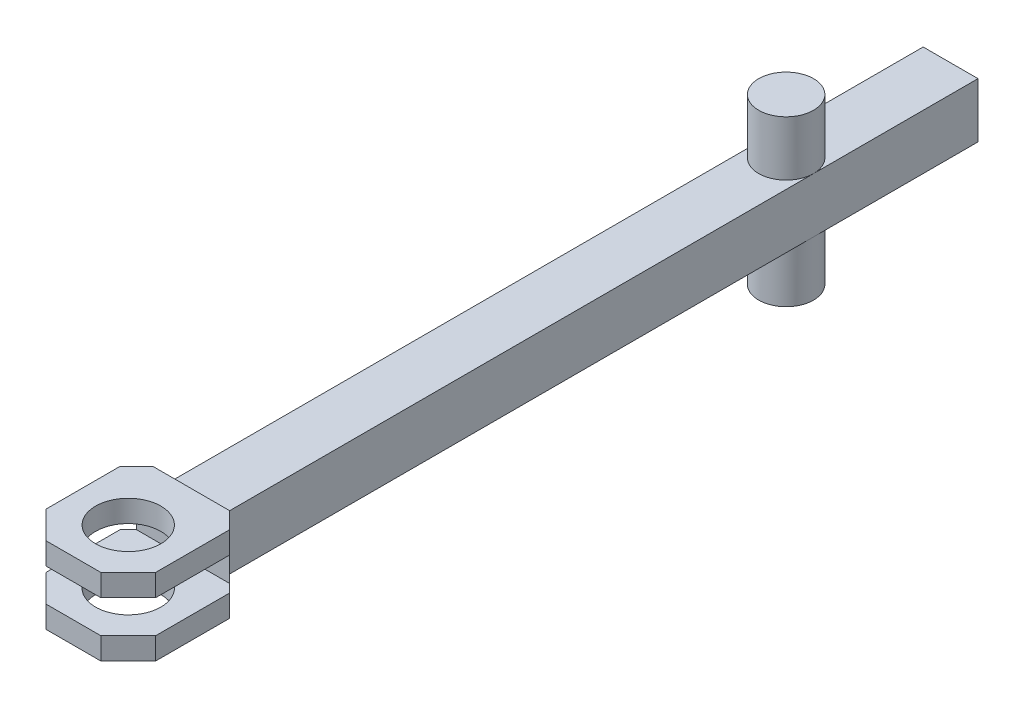
ISO-10303-21;
HEADER;
FILE_DESCRIPTION(('STEP AP214'),'2;1');
FILE_NAME('part.step','',(''),(''),'','','');
FILE_SCHEMA(('AUTOMOTIVE_DESIGN { 1 0 10303 214 1 1 1 1 }'));
ENDSEC;
DATA;
#1=APPLICATION_CONTEXT('core data for automotive mechanical design processes');
#2=APPLICATION_PROTOCOL_DEFINITION('international standard','automotive_design',2000,#1);
#3=PRODUCT_CONTEXT('',#1,'mechanical');
#4=PRODUCT('Part','Part','',(#3));
#5=PRODUCT_RELATED_PRODUCT_CATEGORY('part','',(#4));
#6=PRODUCT_DEFINITION_FORMATION('','',#4);
#7=PRODUCT_DEFINITION_CONTEXT('part definition',#1,'design');
#8=PRODUCT_DEFINITION('design','',#6,#7);
#9=PRODUCT_DEFINITION_SHAPE('','',#8);
#10=(LENGTH_UNIT() NAMED_UNIT(*) SI_UNIT(.MILLI.,.METRE.));
#11=(NAMED_UNIT(*) PLANE_ANGLE_UNIT() SI_UNIT($,.RADIAN.));
#12=(NAMED_UNIT(*) SI_UNIT($,.STERADIAN.) SOLID_ANGLE_UNIT());
#13=UNCERTAINTY_MEASURE_WITH_UNIT(LENGTH_MEASURE(1.E-05),#10,'distance_accuracy_value','');
#14=(GEOMETRIC_REPRESENTATION_CONTEXT(3) GLOBAL_UNCERTAINTY_ASSIGNED_CONTEXT((#13)) GLOBAL_UNIT_ASSIGNED_CONTEXT((#10,
#11,#12)) REPRESENTATION_CONTEXT('',''));
#15=CARTESIAN_POINT('',(0.,0.,0.));
#16=DIRECTION('',(0.,0.,1.));
#17=DIRECTION('',(1.,0.,0.));
#18=AXIS2_PLACEMENT_3D('',#15,#16,#17);
#19=CARTESIAN_POINT('',(-50.,20.,1600.));
#20=DIRECTION('',(1.,0.,0.));
#21=DIRECTION('',(0.,0.,-1.));
#22=AXIS2_PLACEMENT_3D('',#19,#20,#21);
#23=PLANE('',#22);
#24=DIRECTION('',(0.,-1.,0.));
#25=VECTOR('',#24,1.);
#26=CARTESIAN_POINT('',(-50.,20.,1415.02567058549));
#27=LINE('',#26,#25);
#28=CARTESIAN_POINT('',(-50.,20.,1415.02567058549));
#29=VERTEX_POINT('',#28);
#30=CARTESIAN_POINT('',(-49.9999999999999,-20.,1415.02567058549));
#31=VERTEX_POINT('',#30);
#32=EDGE_CURVE('E248',#29,#31,#27,.T.);
#33=ORIENTED_EDGE('',*,*,#32,.T.);
#34=DIRECTION('',(0.,0.,1.));
#35=VECTOR('',#34,1.);
#36=CARTESIAN_POINT('',(-50.,-20.,1600.));
#37=LINE('',#36,#35);
#38=CARTESIAN_POINT('',(-50.,-20.,1550.));
#39=VERTEX_POINT('',#38);
#40=EDGE_CURVE('E279',#31,#39,#37,.T.);
#41=ORIENTED_EDGE('',*,*,#40,.T.);
#42=DIRECTION('',(0.,1.,0.));
#43=VECTOR('',#42,1.);
#44=CARTESIAN_POINT('',(-50.,20.,1550.));
#45=LINE('',#44,#43);
#46=CARTESIAN_POINT('',(-50.,20.,1550.));
#47=VERTEX_POINT('',#46);
#48=EDGE_CURVE('E66',#39,#47,#45,.T.);
#49=ORIENTED_EDGE('',*,*,#48,.T.);
#50=DIRECTION('',(0.,0.,1.));
#51=VECTOR('',#50,1.);
#52=CARTESIAN_POINT('',(-50.,20.,1600.));
#53=LINE('',#52,#51);
#54=EDGE_CURVE('E326',#29,#47,#53,.T.);
#55=ORIENTED_EDGE('',*,*,#54,.F.);
#56=EDGE_LOOP('',(#33,#41,#49,#55));
#57=FACE_BOUND('',#56,.T.);
#58=ADVANCED_FACE('F41',(#57),#23,.F.);
#59=CARTESIAN_POINT('',(150.,20.,1600.));
#60=DIRECTION('',(-1.,0.,0.));
#61=DIRECTION('',(0.,0.,1.));
#62=AXIS2_PLACEMENT_3D('',#59,#60,#61);
#63=PLANE('',#62);
#64=DIRECTION('',(0.,-1.,0.));
#65=VECTOR('',#64,1.);
#66=CARTESIAN_POINT('',(150.,-120.,1550.));
#67=LINE('',#66,#65);
#68=CARTESIAN_POINT('',(150.,20.,1550.));
#69=VERTEX_POINT('',#68);
#70=CARTESIAN_POINT('',(150.,-20.,1550.));
#71=VERTEX_POINT('',#70);
#72=EDGE_CURVE('E417',#69,#71,#67,.T.);
#73=ORIENTED_EDGE('',*,*,#72,.T.);
#74=DIRECTION('',(0.,0.,-1.));
#75=VECTOR('',#74,1.);
#76=CARTESIAN_POINT('',(150.,-20.,1600.));
#77=LINE('',#76,#75);
#78=CARTESIAN_POINT('',(150.,-20.,1415.02567058549));
#79=VERTEX_POINT('',#78);
#80=EDGE_CURVE('E296',#71,#79,#77,.T.);
#81=ORIENTED_EDGE('',*,*,#80,.T.);
#82=DIRECTION('',(0.,1.,0.));
#83=VECTOR('',#82,1.);
#84=CARTESIAN_POINT('',(150.,20.,1415.02567058549));
#85=LINE('',#84,#83);
#86=CARTESIAN_POINT('',(150.,20.,1415.02567058549));
#87=VERTEX_POINT('',#86);
#88=EDGE_CURVE('E411',#79,#87,#85,.T.);
#89=ORIENTED_EDGE('',*,*,#88,.T.);
#90=DIRECTION('',(0.,0.,-1.));
#91=VECTOR('',#90,1.);
#92=CARTESIAN_POINT('',(150.,20.,1600.));
#93=LINE('',#92,#91);
#94=EDGE_CURVE('E333',#69,#87,#93,.T.);
#95=ORIENTED_EDGE('',*,*,#94,.F.);
#96=EDGE_LOOP('',(#73,#81,#89,#95));
#97=FACE_BOUND('',#96,.T.);
#98=ADVANCED_FACE('F475',(#97),#63,.F.);
#99=CARTESIAN_POINT('',(0.,0.,1600.));
#100=DIRECTION('',(0.,0.,1.));
#101=DIRECTION('',(1.,0.,0.));
#102=AXIS2_PLACEMENT_3D('',#99,#100,#101);
#103=PLANE('',#102);
#104=DIRECTION('',(-1.,0.,0.));
#105=VECTOR('',#104,1.);
#106=CARTESIAN_POINT('',(-172.455743270552,-20.,1600.));
#107=LINE('',#106,#105);
#108=CARTESIAN_POINT('',(99.9999999999997,-20.,1600.));
#109=VERTEX_POINT('',#108);
#110=CARTESIAN_POINT('',(0.,-20.,1600.));
#111=VERTEX_POINT('',#110);
#112=EDGE_CURVE('E217',#109,#111,#107,.T.);
#113=ORIENTED_EDGE('',*,*,#112,.F.);
#114=DIRECTION('',(0.,1.,0.));
#115=VECTOR('',#114,1.);
#116=CARTESIAN_POINT('',(99.9999999999998,20.,1600.));
#117=LINE('',#116,#115);
#118=CARTESIAN_POINT('',(99.9999999999997,20.,1600.));
#119=VERTEX_POINT('',#118);
#120=EDGE_CURVE('E229',#109,#119,#117,.T.);
#121=ORIENTED_EDGE('',*,*,#120,.T.);
#122=DIRECTION('',(1.,0.,0.));
#123=VECTOR('',#122,1.);
#124=CARTESIAN_POINT('',(-50.,20.,1600.));
#125=LINE('',#124,#123);
#126=CARTESIAN_POINT('',(0.,20.,1600.));
#127=VERTEX_POINT('',#126);
#128=EDGE_CURVE('E329',#127,#119,#125,.T.);
#129=ORIENTED_EDGE('',*,*,#128,.F.);
#130=DIRECTION('',(0.,-1.,0.));
#131=VECTOR('',#130,1.);
#132=CARTESIAN_POINT('',(0.,-120.,1600.));
#133=LINE('',#132,#131);
#134=EDGE_CURVE('E223',#127,#111,#133,.T.);
#135=ORIENTED_EDGE('',*,*,#134,.T.);
#136=EDGE_LOOP('',(#113,#121,#129,#135));
#137=FACE_BOUND('',#136,.T.);
#138=ADVANCED_FACE('F472',(#137),#103,.T.);
#139=CARTESIAN_POINT('',(150.,20.,1550.));
#140=DIRECTION('',(0.707106781186546,0.,0.707106781186549));
#141=DIRECTION('',(0.,1.,0.));
#142=AXIS2_PLACEMENT_3D('',#139,#140,#141);
#143=PLANE('',#142);
#144=DIRECTION('',(-0.707106781186549,0.,0.707106781186546));
#145=VECTOR('',#144,1.);
#146=CARTESIAN_POINT('',(150.,-20.,1550.));
#147=LINE('',#146,#145);
#148=EDGE_CURVE('E300',#71,#109,#147,.T.);
#149=ORIENTED_EDGE('',*,*,#148,.F.);
#150=ORIENTED_EDGE('',*,*,#72,.F.);
#151=DIRECTION('',(0.707106781186549,0.,-0.707106781186546));
#152=VECTOR('',#151,1.);
#153=CARTESIAN_POINT('',(150.,20.,1550.));
#154=LINE('',#153,#152);
#155=EDGE_CURVE('E244',#119,#69,#154,.T.);
#156=ORIENTED_EDGE('',*,*,#155,.F.);
#157=ORIENTED_EDGE('',*,*,#120,.F.);
#158=EDGE_LOOP('',(#149,#150,#156,#157));
#159=FACE_BOUND('',#158,.T.);
#160=ADVANCED_FACE('F461',(#159),#143,.T.);
#161=CARTESIAN_POINT('',(0.,0.,1600.));
#162=DIRECTION('',(-0.707106781186549,0.,0.707106781186546));
#163=DIRECTION('',(0.,1.,0.));
#164=AXIS2_PLACEMENT_3D('',#161,#162,#163);
#165=PLANE('',#164);
#166=DIRECTION('',(-0.707106781186546,0.,-0.707106781186549));
#167=VECTOR('',#166,1.);
#168=CARTESIAN_POINT('',(0.,-20.,1600.));
#169=LINE('',#168,#167);
#170=EDGE_CURVE('E290',#111,#39,#169,.T.);
#171=ORIENTED_EDGE('',*,*,#170,.F.);
#172=ORIENTED_EDGE('',*,*,#134,.F.);
#173=DIRECTION('',(0.707106781186546,0.,0.707106781186549));
#174=VECTOR('',#173,1.);
#175=CARTESIAN_POINT('',(0.,20.,1600.));
#176=LINE('',#175,#174);
#177=EDGE_CURVE('E241',#47,#127,#176,.T.);
#178=ORIENTED_EDGE('',*,*,#177,.F.);
#179=ORIENTED_EDGE('',*,*,#48,.F.);
#180=EDGE_LOOP('',(#171,#172,#178,#179));
#181=FACE_BOUND('',#180,.T.);
#182=ADVANCED_FACE('F467',(#181),#165,.T.);
#183=CARTESIAN_POINT('',(50.,440.,1500.));
#184=DIRECTION('',(0.,-1.,0.));
#185=DIRECTION('',(0.,0.,-1.));
#186=AXIS2_PLACEMENT_3D('',#183,#184,#185);
#187=CYLINDRICAL_SURFACE('',#186,59.5828419235442);
#188=CARTESIAN_POINT('',(50.,-20.,1500.));
#189=DIRECTION('',(0.,1.,0.));
#190=DIRECTION('',(0.,0.,1.));
#191=AXIS2_PLACEMENT_3D('',#188,#189,#190);
#192=CIRCLE('',#191,59.5828419235442);
#193=CARTESIAN_POINT('',(50.,-20.,1559.58284192354));
#194=VERTEX_POINT('',#193);
#195=EDGE_CURVE('E270',#194,#194,#192,.F.);
#196=ORIENTED_EDGE('',*,*,#195,.T.);
#197=EDGE_LOOP('',(#196));
#198=FACE_BOUND('',#197,.T.);
#199=CARTESIAN_POINT('',(50.,20.,1500.));
#200=DIRECTION('',(0.,-1.,0.));
#201=DIRECTION('',(0.,0.,-1.));
#202=AXIS2_PLACEMENT_3D('',#199,#200,#201);
#203=CIRCLE('',#202,59.5828419235442);
#204=CARTESIAN_POINT('',(50.,20.,1440.41715807646));
#205=VERTEX_POINT('',#204);
#206=EDGE_CURVE('E311',#205,#205,#203,.T.);
#207=ORIENTED_EDGE('',*,*,#206,.F.);
#208=EDGE_LOOP('',(#207));
#209=FACE_BOUND('',#208,.T.);
#210=ADVANCED_FACE('F556',(#198,#209),#187,.F.);
#211=CARTESIAN_POINT('',(0.,0.,1600.));
#212=DIRECTION('',(0.,-1.,0.));
#213=DIRECTION('',(0.,0.,-1.));
#214=AXIS2_PLACEMENT_3D('',#211,#212,#213);
#215=PLANE('',#214);
#216=DIRECTION('',(-1.,0.,0.));
#217=VECTOR('',#216,1.);
#218=CARTESIAN_POINT('',(0.,0.,1365.02567058549));
#219=LINE('',#218,#217);
#220=CARTESIAN_POINT('',(100.,0.,1365.02567058549));
#221=VERTEX_POINT('',#220);
#222=CARTESIAN_POINT('',(0.,0.,1365.02567058549));
#223=VERTEX_POINT('',#222);
#224=EDGE_CURVE('E345',#221,#223,#219,.T.);
#225=ORIENTED_EDGE('',*,*,#224,.F.);
#226=DIRECTION('',(0.,0.,-1.));
#227=VECTOR('',#226,1.);
#228=CARTESIAN_POINT('',(100.,0.,1600.));
#229=LINE('',#228,#227);
#230=CARTESIAN_POINT('',(100.,0.,300.));
#231=VERTEX_POINT('',#230);
#232=EDGE_CURVE('E383',#221,#231,#229,.T.);
#233=ORIENTED_EDGE('',*,*,#232,.T.);
#234=CARTESIAN_POINT('',(50.,0.,300.));
#235=DIRECTION('',(0.,-1.,0.));
#236=DIRECTION('',(0.,0.,-1.));
#237=AXIS2_PLACEMENT_3D('',#234,#235,#236);
#238=CIRCLE('',#237,50.);
#239=CARTESIAN_POINT('',(0.,0.,300.));
#240=VERTEX_POINT('',#239);
#241=EDGE_CURVE('E398',#231,#240,#238,.T.);
#242=ORIENTED_EDGE('',*,*,#241,.T.);
#243=DIRECTION('',(0.,0.,-1.));
#244=VECTOR('',#243,1.);
#245=CARTESIAN_POINT('',(0.,0.,1600.));
#246=LINE('',#245,#244);
#247=EDGE_CURVE('E379',#223,#240,#246,.T.);
#248=ORIENTED_EDGE('',*,*,#247,.F.);
#249=EDGE_LOOP('',(#225,#233,#242,#248));
#250=FACE_BOUND('',#249,.T.);
#251=ADVANCED_FACE('F514',(#250),#215,.F.);
#252=CARTESIAN_POINT('',(0.,0.,1600.));
#253=DIRECTION('',(1.,0.,0.));
#254=DIRECTION('',(0.,0.,-1.));
#255=AXIS2_PLACEMENT_3D('',#252,#253,#254);
#256=PLANE('',#255);
#257=DIRECTION('',(0.,-1.,0.));
#258=VECTOR('',#257,1.);
#259=CARTESIAN_POINT('',(0.,0.,1365.02567058549));
#260=LINE('',#259,#258);
#261=CARTESIAN_POINT('',(0.,-100.,1365.02567058549));
#262=VERTEX_POINT('',#261);
#263=EDGE_CURVE('E341',#223,#262,#260,.T.);
#264=ORIENTED_EDGE('',*,*,#263,.F.);
#265=ORIENTED_EDGE('',*,*,#247,.T.);
#266=CARTESIAN_POINT('',(0.,0.,0.));
#267=VERTEX_POINT('',#266);
#268=EDGE_CURVE('E378',#240,#267,#246,.T.);
#269=ORIENTED_EDGE('',*,*,#268,.T.);
#270=DIRECTION('',(0.,-1.,0.));
#271=VECTOR('',#270,1.);
#272=CARTESIAN_POINT('',(0.,0.,0.));
#273=LINE('',#272,#271);
#274=CARTESIAN_POINT('',(0.,-100.,0.));
#275=VERTEX_POINT('',#274);
#276=EDGE_CURVE('E362',#267,#275,#273,.T.);
#277=ORIENTED_EDGE('',*,*,#276,.T.);
#278=DIRECTION('',(0.,0.,-1.));
#279=VECTOR('',#278,1.);
#280=CARTESIAN_POINT('',(0.,-100.,1600.));
#281=LINE('',#280,#279);
#282=CARTESIAN_POINT('',(0.,-100.,300.));
#283=VERTEX_POINT('',#282);
#284=EDGE_CURVE('E390',#283,#275,#281,.T.);
#285=ORIENTED_EDGE('',*,*,#284,.F.);
#286=EDGE_CURVE('E391',#262,#283,#281,.T.);
#287=ORIENTED_EDGE('',*,*,#286,.F.);
#288=EDGE_LOOP('',(#264,#265,#269,#277,#285,#287));
#289=FACE_BOUND('',#288,.T.);
#290=ADVANCED_FACE('F522',(#289),#256,.F.);
#291=CARTESIAN_POINT('',(0.,-100.,1600.));
#292=DIRECTION('',(0.,1.,0.));
#293=DIRECTION('',(0.,0.,1.));
#294=AXIS2_PLACEMENT_3D('',#291,#292,#293);
#295=PLANE('',#294);
#296=DIRECTION('',(1.,0.,0.));
#297=VECTOR('',#296,1.);
#298=CARTESIAN_POINT('',(0.,-100.,1365.02567058549));
#299=LINE('',#298,#297);
#300=CARTESIAN_POINT('',(100.,-100.,1365.02567058549));
#301=VERTEX_POINT('',#300);
#302=EDGE_CURVE('E337',#262,#301,#299,.T.);
#303=ORIENTED_EDGE('',*,*,#302,.F.);
#304=ORIENTED_EDGE('',*,*,#286,.T.);
#305=CARTESIAN_POINT('',(50.,-100.,300.));
#306=DIRECTION('',(0.,1.,0.));
#307=DIRECTION('',(0.,0.,1.));
#308=AXIS2_PLACEMENT_3D('',#305,#306,#307);
#309=CIRCLE('',#308,50.);
#310=CARTESIAN_POINT('',(100.,-100.,300.));
#311=VERTEX_POINT('',#310);
#312=EDGE_CURVE('E357',#283,#311,#309,.T.);
#313=ORIENTED_EDGE('',*,*,#312,.T.);
#314=DIRECTION('',(0.,0.,-1.));
#315=VECTOR('',#314,1.);
#316=CARTESIAN_POINT('',(100.,-100.,1600.));
#317=LINE('',#316,#315);
#318=EDGE_CURVE('E387',#301,#311,#317,.T.);
#319=ORIENTED_EDGE('',*,*,#318,.F.);
#320=EDGE_LOOP('',(#303,#304,#313,#319));
#321=FACE_BOUND('',#320,.T.);
#322=ADVANCED_FACE('F518',(#321),#295,.F.);
#323=CARTESIAN_POINT('',(100.,0.,1600.));
#324=DIRECTION('',(-1.,0.,0.));
#325=DIRECTION('',(0.,-1.,0.));
#326=AXIS2_PLACEMENT_3D('',#323,#324,#325);
#327=PLANE('',#326);
#328=DIRECTION('',(0.,1.,0.));
#329=VECTOR('',#328,1.);
#330=CARTESIAN_POINT('',(100.,0.,1365.02567058549));
#331=LINE('',#330,#329);
#332=EDGE_CURVE('E399',#301,#221,#331,.T.);
#333=ORIENTED_EDGE('',*,*,#332,.F.);
#334=ORIENTED_EDGE('',*,*,#318,.T.);
#335=CARTESIAN_POINT('',(100.,-100.,0.));
#336=VERTEX_POINT('',#335);
#337=EDGE_CURVE('E386',#311,#336,#317,.T.);
#338=ORIENTED_EDGE('',*,*,#337,.T.);
#339=DIRECTION('',(0.,1.,0.));
#340=VECTOR('',#339,1.);
#341=CARTESIAN_POINT('',(100.,0.,0.));
#342=LINE('',#341,#340);
#343=CARTESIAN_POINT('',(100.,0.,0.));
#344=VERTEX_POINT('',#343);
#345=EDGE_CURVE('E370',#336,#344,#342,.T.);
#346=ORIENTED_EDGE('',*,*,#345,.T.);
#347=EDGE_CURVE('E382',#231,#344,#229,.T.);
#348=ORIENTED_EDGE('',*,*,#347,.F.);
#349=ORIENTED_EDGE('',*,*,#232,.F.);
#350=EDGE_LOOP('',(#333,#334,#338,#346,#348,#349));
#351=FACE_BOUND('',#350,.T.);
#352=ADVANCED_FACE('F515',(#351),#327,.F.);
#353=ORIENTED_EDGE('',*,*,#337,.F.);
#354=EDGE_CURVE('E361',#311,#283,#309,.T.);
#355=ORIENTED_EDGE('',*,*,#354,.T.);
#356=ORIENTED_EDGE('',*,*,#284,.T.);
#357=DIRECTION('',(1.,0.,0.));
#358=VECTOR('',#357,1.);
#359=CARTESIAN_POINT('',(0.,-100.,0.));
#360=LINE('',#359,#358);
#361=EDGE_CURVE('E366',#275,#336,#360,.T.);
#362=ORIENTED_EDGE('',*,*,#361,.T.);
#363=EDGE_LOOP('',(#353,#355,#356,#362));
#364=FACE_BOUND('',#363,.T.);
#365=ADVANCED_FACE('F512',(#364),#295,.F.);
#366=ORIENTED_EDGE('',*,*,#268,.F.);
#367=EDGE_CURVE('E394',#240,#231,#238,.T.);
#368=ORIENTED_EDGE('',*,*,#367,.T.);
#369=ORIENTED_EDGE('',*,*,#347,.T.);
#370=DIRECTION('',(-1.,0.,0.));
#371=VECTOR('',#370,1.);
#372=CARTESIAN_POINT('',(0.,0.,0.));
#373=LINE('',#372,#371);
#374=EDGE_CURVE('E374',#344,#267,#373,.T.);
#375=ORIENTED_EDGE('',*,*,#374,.T.);
#376=EDGE_LOOP('',(#366,#368,#369,#375));
#377=FACE_BOUND('',#376,.T.);
#378=ADVANCED_FACE('F508',(#377),#215,.F.);
#379=CARTESIAN_POINT('',(0.,0.,0.));
#380=DIRECTION('',(0.,0.,1.));
#381=DIRECTION('',(1.,0.,0.));
#382=AXIS2_PLACEMENT_3D('',#379,#380,#381);
#383=PLANE('',#382);
#384=ORIENTED_EDGE('',*,*,#276,.F.);
#385=ORIENTED_EDGE('',*,*,#374,.F.);
#386=ORIENTED_EDGE('',*,*,#345,.F.);
#387=ORIENTED_EDGE('',*,*,#361,.F.);
#388=EDGE_LOOP('',(#384,#385,#386,#387));
#389=FACE_BOUND('',#388,.T.);
#390=ADVANCED_FACE('F501',(#389),#383,.F.);
#391=CARTESIAN_POINT('',(50.,100.,300.));
#392=DIRECTION('',(0.,-1.,0.));
#393=DIRECTION('',(0.,0.,-1.));
#394=AXIS2_PLACEMENT_3D('',#391,#392,#393);
#395=PLANE('',#394);
#396=CARTESIAN_POINT('',(50.,100.,300.));
#397=DIRECTION('',(0.,-1.,0.));
#398=DIRECTION('',(0.,0.,-1.));
#399=AXIS2_PLACEMENT_3D('',#396,#397,#398);
#400=CIRCLE('',#399,50.);
#401=CARTESIAN_POINT('',(50.,100.,250.));
#402=VERTEX_POINT('',#401);
#403=EDGE_CURVE('E353',#402,#402,#400,.T.);
#404=ORIENTED_EDGE('',*,*,#403,.F.);
#405=EDGE_LOOP('',(#404));
#406=FACE_BOUND('',#405,.T.);
#407=ADVANCED_FACE('F499',(#406),#395,.F.);
#408=CARTESIAN_POINT('',(50.,100.,300.));
#409=DIRECTION('',(0.,-1.,0.));
#410=DIRECTION('',(0.,0.,-1.));
#411=AXIS2_PLACEMENT_3D('',#408,#409,#410);
#412=CYLINDRICAL_SURFACE('',#411,50.);
#413=ORIENTED_EDGE('',*,*,#403,.T.);
#414=EDGE_LOOP('',(#413));
#415=FACE_BOUND('',#414,.T.);
#416=ORIENTED_EDGE('',*,*,#241,.F.);
#417=ORIENTED_EDGE('',*,*,#367,.F.);
#418=EDGE_LOOP('',(#416,#417));
#419=FACE_BOUND('',#418,.T.);
#420=ADVANCED_FACE('F495',(#415,#419),#412,.T.);
#421=CARTESIAN_POINT('',(50.,-200.,300.));
#422=DIRECTION('',(0.,-1.,0.));
#423=DIRECTION('',(0.,0.,-1.));
#424=AXIS2_PLACEMENT_3D('',#421,#422,#423);
#425=CIRCLE('',#424,50.);
#426=CARTESIAN_POINT('',(50.,-200.,250.));
#427=VERTEX_POINT('',#426);
#428=EDGE_CURVE('E349',#427,#427,#425,.T.);
#429=ORIENTED_EDGE('',*,*,#428,.F.);
#430=EDGE_LOOP('',(#429));
#431=FACE_BOUND('',#430,.T.);
#432=ORIENTED_EDGE('',*,*,#354,.F.);
#433=ORIENTED_EDGE('',*,*,#312,.F.);
#434=EDGE_LOOP('',(#432,#433));
#435=FACE_BOUND('',#434,.T.);
#436=ADVANCED_FACE('F490',(#431,#435),#412,.T.);
#437=CARTESIAN_POINT('',(50.,-200.,300.));
#438=DIRECTION('',(0.,-1.,0.));
#439=DIRECTION('',(0.,0.,-1.));
#440=AXIS2_PLACEMENT_3D('',#437,#438,#439);
#441=PLANE('',#440);
#442=ORIENTED_EDGE('',*,*,#428,.T.);
#443=EDGE_LOOP('',(#442));
#444=FACE_BOUND('',#443,.T.);
#445=ADVANCED_FACE('F484',(#444),#441,.T.);
#446=CARTESIAN_POINT('',(-50.,-120.,1550.));
#447=VERTEX_POINT('',#446);
#448=CARTESIAN_POINT('',(-50.,-80.,1550.));
#449=VERTEX_POINT('',#448);
#450=EDGE_CURVE('E252',#447,#449,#45,.T.);
#451=ORIENTED_EDGE('',*,*,#450,.T.);
#452=DIRECTION('',(0.,0.,-1.));
#453=VECTOR('',#452,1.);
#454=CARTESIAN_POINT('',(-50.,-80.,1600.));
#455=LINE('',#454,#453);
#456=CARTESIAN_POINT('',(-49.9999999999999,-80.,1415.02567058549));
#457=VERTEX_POINT('',#456);
#458=EDGE_CURVE('E200',#449,#457,#455,.T.);
#459=ORIENTED_EDGE('',*,*,#458,.T.);
#460=CARTESIAN_POINT('',(-50.,-120.,1415.02567058549));
#461=VERTEX_POINT('',#460);
#462=EDGE_CURVE('E247',#457,#461,#27,.T.);
#463=ORIENTED_EDGE('',*,*,#462,.T.);
#464=DIRECTION('',(0.,0.,1.));
#465=VECTOR('',#464,1.);
#466=CARTESIAN_POINT('',(-50.,-120.,1600.));
#467=LINE('',#466,#465);
#468=EDGE_CURVE('E315',#461,#447,#467,.T.);
#469=ORIENTED_EDGE('',*,*,#468,.T.);
#470=EDGE_LOOP('',(#451,#459,#463,#469));
#471=FACE_BOUND('',#470,.T.);
#472=ADVANCED_FACE('F432',(#471),#23,.F.);
#473=CARTESIAN_POINT('',(150.,-120.,1415.02567058549));
#474=VERTEX_POINT('',#473);
#475=CARTESIAN_POINT('',(150.,-80.,1415.02567058549));
#476=VERTEX_POINT('',#475);
#477=EDGE_CURVE('E412',#474,#476,#85,.T.);
#478=ORIENTED_EDGE('',*,*,#477,.T.);
#479=DIRECTION('',(0.,0.,1.));
#480=VECTOR('',#479,1.);
#481=CARTESIAN_POINT('',(150.,-80.,1600.));
#482=LINE('',#481,#480);
#483=CARTESIAN_POINT('',(150.,-80.,1550.));
#484=VERTEX_POINT('',#483);
#485=EDGE_CURVE('E281',#476,#484,#482,.T.);
#486=ORIENTED_EDGE('',*,*,#485,.T.);
#487=CARTESIAN_POINT('',(150.,-120.,1550.));
#488=VERTEX_POINT('',#487);
#489=EDGE_CURVE('E416',#484,#488,#67,.T.);
#490=ORIENTED_EDGE('',*,*,#489,.T.);
#491=DIRECTION('',(0.,0.,-1.));
#492=VECTOR('',#491,1.);
#493=CARTESIAN_POINT('',(150.,-120.,1600.));
#494=LINE('',#493,#492);
#495=EDGE_CURVE('E322',#488,#474,#494,.T.);
#496=ORIENTED_EDGE('',*,*,#495,.T.);
#497=EDGE_LOOP('',(#478,#486,#490,#496));
#498=FACE_BOUND('',#497,.T.);
#499=ADVANCED_FACE('F453',(#498),#63,.F.);
#500=CARTESIAN_POINT('',(0.,20.,0.));
#501=DIRECTION('',(0.,-1.,0.));
#502=DIRECTION('',(0.,0.,-1.));
#503=AXIS2_PLACEMENT_3D('',#500,#501,#502);
#504=PLANE('',#503);
#505=ORIENTED_EDGE('',*,*,#206,.T.);
#506=EDGE_LOOP('',(#505));
#507=FACE_BOUND('',#506,.T.);
#508=ORIENTED_EDGE('',*,*,#128,.T.);
#509=ORIENTED_EDGE('',*,*,#155,.T.);
#510=ORIENTED_EDGE('',*,*,#94,.T.);
#511=DIRECTION('',(0.707106781186548,0.,0.707106781186547));
#512=VECTOR('',#511,1.);
#513=CARTESIAN_POINT('',(100.,20.,1365.02567058549));
#514=LINE('',#513,#512);
#515=CARTESIAN_POINT('',(120.,20.,1385.02567058549));
#516=VERTEX_POINT('',#515);
#517=EDGE_CURVE('E238',#87,#516,#514,.F.);
#518=ORIENTED_EDGE('',*,*,#517,.T.);
#519=DIRECTION('',(-1.,0.,0.));
#520=VECTOR('',#519,1.);
#521=CARTESIAN_POINT('',(0.,20.,1385.02567058549));
#522=LINE('',#521,#520);
#523=CARTESIAN_POINT('',(-20.0000000000001,20.,1385.02567058549));
#524=VERTEX_POINT('',#523);
#525=EDGE_CURVE('E403',#516,#524,#522,.T.);
#526=ORIENTED_EDGE('',*,*,#525,.T.);
#527=DIRECTION('',(0.707106781186549,0.,-0.707106781186546));
#528=VECTOR('',#527,1.);
#529=CARTESIAN_POINT('',(-50.,20.,1415.02567058549));
#530=LINE('',#529,#528);
#531=EDGE_CURVE('E235',#524,#29,#530,.F.);
#532=ORIENTED_EDGE('',*,*,#531,.T.);
#533=ORIENTED_EDGE('',*,*,#54,.T.);
#534=ORIENTED_EDGE('',*,*,#177,.T.);
#535=EDGE_LOOP('',(#508,#509,#510,#518,#526,#532,#533,#534));
#536=FACE_BOUND('',#535,.T.);
#537=ADVANCED_FACE('F489',(#507,#536),#504,.F.);
#538=CARTESIAN_POINT('',(0.,-120.,0.));
#539=DIRECTION('',(0.,-1.,0.));
#540=DIRECTION('',(0.,0.,-1.));
#541=AXIS2_PLACEMENT_3D('',#538,#539,#540);
#542=PLANE('',#541);
#543=CARTESIAN_POINT('',(50.,-120.,1500.));
#544=DIRECTION('',(0.,-1.,0.));
#545=DIRECTION('',(0.,0.,-1.));
#546=AXIS2_PLACEMENT_3D('',#543,#544,#545);
#547=CIRCLE('',#546,59.5828419235442);
#548=CARTESIAN_POINT('',(50.,-120.,1440.41715807646));
#549=VERTEX_POINT('',#548);
#550=EDGE_CURVE('E307',#549,#549,#547,.T.);
#551=ORIENTED_EDGE('',*,*,#550,.F.);
#552=EDGE_LOOP('',(#551));
#553=FACE_BOUND('',#552,.T.);
#554=ORIENTED_EDGE('',*,*,#495,.F.);
#555=DIRECTION('',(-0.707106781186549,0.,0.707106781186546));
#556=VECTOR('',#555,1.);
#557=CARTESIAN_POINT('',(850.,-120.,850.000000000004));
#558=LINE('',#557,#556);
#559=CARTESIAN_POINT('',(99.9999999999997,-120.,1600.));
#560=VERTEX_POINT('',#559);
#561=EDGE_CURVE('E224',#488,#560,#558,.T.);
#562=ORIENTED_EDGE('',*,*,#561,.T.);
#563=DIRECTION('',(1.,0.,0.));
#564=VECTOR('',#563,1.);
#565=CARTESIAN_POINT('',(-50.,-120.,1600.));
#566=LINE('',#565,#564);
#567=CARTESIAN_POINT('',(0.,-120.,1600.));
#568=VERTEX_POINT('',#567);
#569=EDGE_CURVE('E319',#568,#560,#566,.T.);
#570=ORIENTED_EDGE('',*,*,#569,.F.);
#571=DIRECTION('',(-0.707106781186546,0.,-0.707106781186549));
#572=VECTOR('',#571,1.);
#573=CARTESIAN_POINT('',(-800.,-120.,799.999999999996));
#574=LINE('',#573,#572);
#575=EDGE_CURVE('E220',#568,#447,#574,.T.);
#576=ORIENTED_EDGE('',*,*,#575,.T.);
#577=ORIENTED_EDGE('',*,*,#468,.F.);
#578=DIRECTION('',(-0.707106781186549,0.,0.707106781186546));
#579=VECTOR('',#578,1.);
#580=CARTESIAN_POINT('',(682.512835292743,-120.,682.512835292746));
#581=LINE('',#580,#579);
#582=CARTESIAN_POINT('',(-19.9999999999999,-120.,1385.02567058549));
#583=VERTEX_POINT('',#582);
#584=EDGE_CURVE('E421',#461,#583,#581,.F.);
#585=ORIENTED_EDGE('',*,*,#584,.T.);
#586=DIRECTION('',(1.,0.,0.));
#587=VECTOR('',#586,1.);
#588=CARTESIAN_POINT('',(150.,-120.,1385.02567058549));
#589=LINE('',#588,#587);
#590=CARTESIAN_POINT('',(120.,-120.,1385.02567058549));
#591=VERTEX_POINT('',#590);
#592=EDGE_CURVE('E407',#583,#591,#589,.T.);
#593=ORIENTED_EDGE('',*,*,#592,.T.);
#594=DIRECTION('',(-0.707106781186548,0.,-0.707106781186547));
#595=VECTOR('',#594,1.);
#596=CARTESIAN_POINT('',(-632.512835292743,-120.,632.512835292743));
#597=LINE('',#596,#595);
#598=EDGE_CURVE('E424',#591,#474,#597,.F.);
#599=ORIENTED_EDGE('',*,*,#598,.T.);
#600=EDGE_LOOP('',(#554,#562,#570,#576,#577,#585,#593,#599));
#601=FACE_BOUND('',#600,.T.);
#602=ADVANCED_FACE('F430',(#553,#601),#542,.T.);
#603=DIRECTION('',(1.,0.,0.));
#604=VECTOR('',#603,1.);
#605=CARTESIAN_POINT('',(-172.455743270552,-80.,1600.));
#606=LINE('',#605,#604);
#607=CARTESIAN_POINT('',(0.,-80.,1600.));
#608=VERTEX_POINT('',#607);
#609=CARTESIAN_POINT('',(99.9999999999997,-80.,1600.));
#610=VERTEX_POINT('',#609);
#611=EDGE_CURVE('E197',#608,#610,#606,.T.);
#612=ORIENTED_EDGE('',*,*,#611,.F.);
#613=EDGE_CURVE('E212',#608,#568,#133,.T.);
#614=ORIENTED_EDGE('',*,*,#613,.T.);
#615=ORIENTED_EDGE('',*,*,#569,.T.);
#616=EDGE_CURVE('E215',#560,#610,#117,.T.);
#617=ORIENTED_EDGE('',*,*,#616,.T.);
#618=EDGE_LOOP('',(#612,#614,#615,#617));
#619=FACE_BOUND('',#618,.T.);
#620=ADVANCED_FACE('F210',(#619),#103,.T.);
#621=CARTESIAN_POINT('',(0.,20.,1385.02567058549));
#622=DIRECTION('',(0.,-0.707106781186551,0.707106781186543));
#623=DIRECTION('',(-1.,0.,0.));
#624=AXIS2_PLACEMENT_3D('',#621,#622,#623);
#625=PLANE('',#624);
#626=ORIENTED_EDGE('',*,*,#525,.F.);
#627=DIRECTION('',(-0.577350269189628,-0.577350269189621,-0.577350269189628));
#628=VECTOR('',#627,1.);
#629=CARTESIAN_POINT('',(79.9999999999998,-19.9999999999999,1345.02567058549));
#630=LINE('',#629,#628);
#631=EDGE_CURVE('E51',#516,#221,#630,.T.);
#632=ORIENTED_EDGE('',*,*,#631,.T.);
#633=ORIENTED_EDGE('',*,*,#224,.T.);
#634=DIRECTION('',(-0.57735026918963,0.577350269189621,0.577350269189627));
#635=VECTOR('',#634,1.);
#636=CARTESIAN_POINT('',(-13.3333333333333,13.3333333333333,1378.35900391882));
#637=LINE('',#636,#635);
#638=EDGE_CURVE('E261',#223,#524,#637,.T.);
#639=ORIENTED_EDGE('',*,*,#638,.T.);
#640=EDGE_LOOP('',(#626,#632,#633,#639));
#641=FACE_BOUND('',#640,.T.);
#642=ADVANCED_FACE('F468',(#641),#625,.F.);
#643=CARTESIAN_POINT('',(-50.,-100.,1365.02567058549));
#644=DIRECTION('',(0.,-0.707106781186547,-0.707106781186547));
#645=DIRECTION('',(1.,0.,0.));
#646=AXIS2_PLACEMENT_3D('',#643,#644,#645);
#647=PLANE('',#646);
#648=ORIENTED_EDGE('',*,*,#302,.T.);
#649=DIRECTION('',(-0.577350269189626,0.577350269189626,-0.577350269189626));
#650=VECTOR('',#649,1.);
#651=CARTESIAN_POINT('',(50.,-50.,1315.02567058549));
#652=LINE('',#651,#650);
#653=EDGE_CURVE('E258',#301,#591,#652,.F.);
#654=ORIENTED_EDGE('',*,*,#653,.T.);
#655=ORIENTED_EDGE('',*,*,#592,.F.);
#656=DIRECTION('',(-0.577350269189628,-0.577350269189625,0.577350269189625));
#657=VECTOR('',#656,1.);
#658=CARTESIAN_POINT('',(-16.6666666666666,-116.666666666667,1381.69233725215));
#659=LINE('',#658,#657);
#660=EDGE_CURVE('E255',#583,#262,#659,.F.);
#661=ORIENTED_EDGE('',*,*,#660,.T.);
#662=EDGE_LOOP('',(#648,#654,#655,#661));
#663=FACE_BOUND('',#662,.T.);
#664=ADVANCED_FACE('F443',(#663),#647,.T.);
#665=DIRECTION('',(0.707106781186549,0.,-0.707106781186546));
#666=VECTOR('',#665,1.);
#667=CARTESIAN_POINT('',(150.,-80.,1550.));
#668=LINE('',#667,#666);
#669=EDGE_CURVE('E274',#610,#484,#668,.T.);
#670=ORIENTED_EDGE('',*,*,#669,.F.);
#671=ORIENTED_EDGE('',*,*,#616,.F.);
#672=ORIENTED_EDGE('',*,*,#561,.F.);
#673=ORIENTED_EDGE('',*,*,#489,.F.);
#674=EDGE_LOOP('',(#670,#671,#672,#673));
#675=FACE_BOUND('',#674,.T.);
#676=ADVANCED_FACE('F458',(#675),#143,.T.);
#677=DIRECTION('',(0.707106781186546,0.,0.707106781186549));
#678=VECTOR('',#677,1.);
#679=CARTESIAN_POINT('',(0.,-80.,1600.));
#680=LINE('',#679,#678);
#681=EDGE_CURVE('E193',#449,#608,#680,.T.);
#682=ORIENTED_EDGE('',*,*,#681,.F.);
#683=ORIENTED_EDGE('',*,*,#450,.F.);
#684=ORIENTED_EDGE('',*,*,#575,.F.);
#685=ORIENTED_EDGE('',*,*,#613,.F.);
#686=EDGE_LOOP('',(#682,#683,#684,#685));
#687=FACE_BOUND('',#686,.T.);
#688=ADVANCED_FACE('F219',(#687),#165,.T.);
#689=CARTESIAN_POINT('',(100.,20.,1365.02567058549));
#690=DIRECTION('',(-0.707106781186547,0.,0.707106781186548));
#691=DIRECTION('',(0.,-1.,0.));
#692=AXIS2_PLACEMENT_3D('',#689,#690,#691);
#693=PLANE('',#692);
#694=DIRECTION('',(-0.707106781186548,0.,-0.707106781186547));
#695=VECTOR('',#694,1.);
#696=CARTESIAN_POINT('',(100.,-20.,1365.02567058549));
#697=LINE('',#696,#695);
#698=CARTESIAN_POINT('',(134.974329414514,-20.,1400.));
#699=VERTEX_POINT('',#698);
#700=EDGE_CURVE('E293',#699,#79,#697,.F.);
#701=ORIENTED_EDGE('',*,*,#700,.F.);
#702=DIRECTION('',(0.,1.,0.));
#703=VECTOR('',#702,1.);
#704=CARTESIAN_POINT('',(134.974329414514,20.,1400.));
#705=LINE('',#704,#703);
#706=CARTESIAN_POINT('',(134.974329414514,-80.,1400.));
#707=VERTEX_POINT('',#706);
#708=EDGE_CURVE('E303',#699,#707,#705,.F.);
#709=ORIENTED_EDGE('',*,*,#708,.T.);
#710=DIRECTION('',(0.707106781186548,0.,0.707106781186547));
#711=VECTOR('',#710,1.);
#712=CARTESIAN_POINT('',(100.,-80.,1365.02567058549));
#713=LINE('',#712,#711);
#714=EDGE_CURVE('E206',#476,#707,#713,.F.);
#715=ORIENTED_EDGE('',*,*,#714,.F.);
#716=ORIENTED_EDGE('',*,*,#477,.F.);
#717=ORIENTED_EDGE('',*,*,#598,.F.);
#718=ORIENTED_EDGE('',*,*,#653,.F.);
#719=ORIENTED_EDGE('',*,*,#332,.T.);
#720=ORIENTED_EDGE('',*,*,#631,.F.);
#721=ORIENTED_EDGE('',*,*,#517,.F.);
#722=ORIENTED_EDGE('',*,*,#88,.F.);
#723=EDGE_LOOP('',(#701,#709,#715,#716,#717,#718,#719,#720,#721,#722));
#724=FACE_BOUND('',#723,.T.);
#725=ADVANCED_FACE('F448',(#724),#693,.F.);
#726=CARTESIAN_POINT('',(-50.,20.,1415.02567058549));
#727=DIRECTION('',(0.707106781186546,0.,0.707106781186549));
#728=DIRECTION('',(0.,-1.,0.));
#729=AXIS2_PLACEMENT_3D('',#726,#727,#728);
#730=PLANE('',#729);
#731=DIRECTION('',(-0.707106781186549,0.,0.707106781186546));
#732=VECTOR('',#731,1.);
#733=CARTESIAN_POINT('',(-50.,-20.,1415.02567058549));
#734=LINE('',#733,#732);
#735=CARTESIAN_POINT('',(-34.9743294145141,-20.,1400.));
#736=VERTEX_POINT('',#735);
#737=EDGE_CURVE('E273',#31,#736,#734,.F.);
#738=ORIENTED_EDGE('',*,*,#737,.F.);
#739=ORIENTED_EDGE('',*,*,#32,.F.);
#740=ORIENTED_EDGE('',*,*,#531,.F.);
#741=ORIENTED_EDGE('',*,*,#638,.F.);
#742=ORIENTED_EDGE('',*,*,#263,.T.);
#743=ORIENTED_EDGE('',*,*,#660,.F.);
#744=ORIENTED_EDGE('',*,*,#584,.F.);
#745=ORIENTED_EDGE('',*,*,#462,.F.);
#746=DIRECTION('',(0.707106781186549,0.,-0.707106781186546));
#747=VECTOR('',#746,1.);
#748=CARTESIAN_POINT('',(-50.,-80.,1415.02567058549));
#749=LINE('',#748,#747);
#750=CARTESIAN_POINT('',(-34.9743294145141,-80.,1400.));
#751=VERTEX_POINT('',#750);
#752=EDGE_CURVE('E269',#751,#457,#749,.F.);
#753=ORIENTED_EDGE('',*,*,#752,.F.);
#754=DIRECTION('',(0.,-1.,0.));
#755=VECTOR('',#754,1.);
#756=CARTESIAN_POINT('',(-34.9743294145141,20.,1400.));
#757=LINE('',#756,#755);
#758=EDGE_CURVE('E11',#751,#736,#757,.F.);
#759=ORIENTED_EDGE('',*,*,#758,.T.);
#760=EDGE_LOOP('',(#738,#739,#740,#741,#742,#743,#744,#745,#753,#759));
#761=FACE_BOUND('',#760,.T.);
#762=ADVANCED_FACE('F44',(#761),#730,.F.);
#763=CARTESIAN_POINT('',(50.,-80.,1500.));
#764=DIRECTION('',(0.,-1.,0.));
#765=DIRECTION('',(0.,0.,-1.));
#766=AXIS2_PLACEMENT_3D('',#763,#764,#765);
#767=CIRCLE('',#766,59.5828419235442);
#768=CARTESIAN_POINT('',(50.,-80.,1440.41715807646));
#769=VERTEX_POINT('',#768);
#770=EDGE_CURVE('E266',#769,#769,#767,.F.);
#771=ORIENTED_EDGE('',*,*,#770,.T.);
#772=EDGE_LOOP('',(#771));
#773=FACE_BOUND('',#772,.T.);
#774=ORIENTED_EDGE('',*,*,#550,.T.);
#775=EDGE_LOOP('',(#774));
#776=FACE_BOUND('',#775,.T.);
#777=ADVANCED_FACE('F549',(#773,#776),#187,.F.);
#778=CARTESIAN_POINT('',(-172.455743270552,-20.,1400.));
#779=DIRECTION('',(0.,1.,0.));
#780=DIRECTION('',(0.,0.,1.));
#781=AXIS2_PLACEMENT_3D('',#778,#779,#780);
#782=PLANE('',#781);
#783=ORIENTED_EDGE('',*,*,#148,.T.);
#784=ORIENTED_EDGE('',*,*,#112,.T.);
#785=ORIENTED_EDGE('',*,*,#170,.T.);
#786=ORIENTED_EDGE('',*,*,#40,.F.);
#787=ORIENTED_EDGE('',*,*,#737,.T.);
#788=DIRECTION('',(-1.,0.,0.));
#789=VECTOR('',#788,1.);
#790=CARTESIAN_POINT('',(-172.455743270552,-20.,1400.));
#791=LINE('',#790,#789);
#792=EDGE_CURVE('E58',#699,#736,#791,.T.);
#793=ORIENTED_EDGE('',*,*,#792,.F.);
#794=ORIENTED_EDGE('',*,*,#700,.T.);
#795=ORIENTED_EDGE('',*,*,#80,.F.);
#796=EDGE_LOOP('',(#783,#784,#785,#786,#787,#793,#794,#795));
#797=FACE_BOUND('',#796,.T.);
#798=ORIENTED_EDGE('',*,*,#195,.F.);
#799=EDGE_LOOP('',(#798));
#800=FACE_BOUND('',#799,.T.);
#801=ADVANCED_FACE('F553',(#797,#800),#782,.F.);
#802=CARTESIAN_POINT('',(-172.455743270552,-80.,1400.));
#803=DIRECTION('',(0.,-1.,0.));
#804=DIRECTION('',(0.,0.,-1.));
#805=AXIS2_PLACEMENT_3D('',#802,#803,#804);
#806=PLANE('',#805);
#807=ORIENTED_EDGE('',*,*,#669,.T.);
#808=ORIENTED_EDGE('',*,*,#485,.F.);
#809=ORIENTED_EDGE('',*,*,#714,.T.);
#810=DIRECTION('',(1.,0.,0.));
#811=VECTOR('',#810,1.);
#812=CARTESIAN_POINT('',(-172.455743270552,-80.,1400.));
#813=LINE('',#812,#811);
#814=EDGE_CURVE('E628',#751,#707,#813,.T.);
#815=ORIENTED_EDGE('',*,*,#814,.F.);
#816=ORIENTED_EDGE('',*,*,#752,.T.);
#817=ORIENTED_EDGE('',*,*,#458,.F.);
#818=ORIENTED_EDGE('',*,*,#681,.T.);
#819=ORIENTED_EDGE('',*,*,#611,.T.);
#820=EDGE_LOOP('',(#807,#808,#809,#815,#816,#817,#818,#819));
#821=FACE_BOUND('',#820,.T.);
#822=ORIENTED_EDGE('',*,*,#770,.F.);
#823=EDGE_LOOP('',(#822));
#824=FACE_BOUND('',#823,.T.);
#825=ADVANCED_FACE('F195',(#821,#824),#806,.F.);
#826=CARTESIAN_POINT('',(0.,0.,1400.));
#827=DIRECTION('',(0.,0.,1.));
#828=DIRECTION('',(1.,0.,0.));
#829=AXIS2_PLACEMENT_3D('',#826,#827,#828);
#830=PLANE('',#829);
#831=ORIENTED_EDGE('',*,*,#792,.T.);
#832=ORIENTED_EDGE('',*,*,#758,.F.);
#833=ORIENTED_EDGE('',*,*,#814,.T.);
#834=ORIENTED_EDGE('',*,*,#708,.F.);
#835=EDGE_LOOP('',(#831,#832,#833,#834));
#836=FACE_BOUND('',#835,.T.);
#837=ADVANCED_FACE('F640',(#836),#830,.T.);
#838=CLOSED_SHELL('',(#58,#98,#138,#160,#182,#210,#251,#290,#322,#352,#365,#378,#390,#407,#420,
#436,#445,#472,#499,#537,#602,#620,#642,#664,#676,#688,#725,#762,#777,#801,#825,#837));
#839=MANIFOLD_SOLID_BREP('B2',#838);
#840=ADVANCED_BREP_SHAPE_REPRESENTATION('',(#18,#839),#14);
#841=SHAPE_DEFINITION_REPRESENTATION(#9,#840);
ENDSEC;
END-ISO-10303-21;
